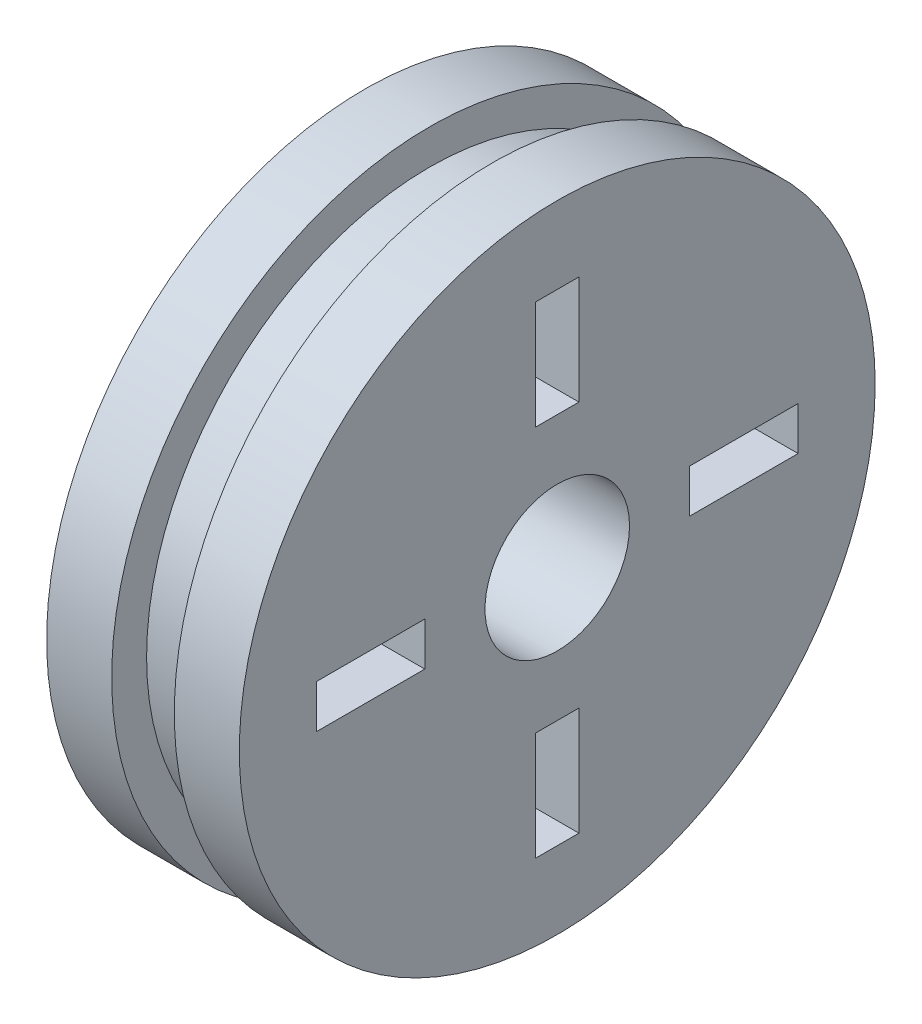
ISO-10303-21;
HEADER;
FILE_DESCRIPTION(('STEP AP214'),'2;1');
FILE_NAME('part.step','',(''),(''),'','','');
FILE_SCHEMA(('AUTOMOTIVE_DESIGN { 1 0 10303 214 1 1 1 1 }'));
ENDSEC;
DATA;
#1=APPLICATION_CONTEXT('core data for automotive mechanical design processes');
#2=APPLICATION_PROTOCOL_DEFINITION('international standard','automotive_design',2000,#1);
#3=PRODUCT_CONTEXT('',#1,'mechanical');
#4=PRODUCT('Part','Part','',(#3));
#5=PRODUCT_RELATED_PRODUCT_CATEGORY('part','',(#4));
#6=PRODUCT_DEFINITION_FORMATION('','',#4);
#7=PRODUCT_DEFINITION_CONTEXT('part definition',#1,'design');
#8=PRODUCT_DEFINITION('design','',#6,#7);
#9=PRODUCT_DEFINITION_SHAPE('','',#8);
#10=(LENGTH_UNIT() NAMED_UNIT(*) SI_UNIT(.MILLI.,.METRE.));
#11=(NAMED_UNIT(*) PLANE_ANGLE_UNIT() SI_UNIT($,.RADIAN.));
#12=(NAMED_UNIT(*) SI_UNIT($,.STERADIAN.) SOLID_ANGLE_UNIT());
#13=UNCERTAINTY_MEASURE_WITH_UNIT(LENGTH_MEASURE(1.E-05),#10,'distance_accuracy_value','');
#14=(GEOMETRIC_REPRESENTATION_CONTEXT(3) GLOBAL_UNCERTAINTY_ASSIGNED_CONTEXT((#13)) GLOBAL_UNIT_ASSIGNED_CONTEXT((#10,
#11,#12)) REPRESENTATION_CONTEXT('',''));
#15=CARTESIAN_POINT('',(0.,0.,0.));
#16=DIRECTION('',(0.,0.,1.));
#17=DIRECTION('',(1.,0.,0.));
#18=AXIS2_PLACEMENT_3D('',#15,#16,#17);
#19=CARTESIAN_POINT('',(85.2,-65.,-52.));
#20=DIRECTION('',(1.,0.,0.));
#21=DIRECTION('',(0.,0.,-1.));
#22=AXIS2_PLACEMENT_3D('',#19,#20,#21);
#23=PLANE('',#22);
#24=CARTESIAN_POINT('',(85.2,-65.,-52.));
#25=DIRECTION('',(1.,0.,0.));
#26=DIRECTION('',(0.,0.,-1.));
#27=AXIS2_PLACEMENT_3D('',#24,#25,#26);
#28=CIRCLE('',#27,3.);
#29=CARTESIAN_POINT('',(85.2,-65.,-55.));
#30=VERTEX_POINT('',#29);
#31=EDGE_CURVE('E936',#30,#30,#28,.F.);
#32=ORIENTED_EDGE('',*,*,#31,.T.);
#33=EDGE_LOOP('',(#32));
#34=FACE_BOUND('',#33,.T.);
#35=CARTESIAN_POINT('',(85.2,-65.,-52.));
#36=DIRECTION('',(1.,0.,0.));
#37=DIRECTION('',(0.,0.,-1.));
#38=AXIS2_PLACEMENT_3D('',#35,#36,#37);
#39=CIRCLE('',#38,13.2);
#40=CARTESIAN_POINT('',(85.2,-65.,-65.2));
#41=VERTEX_POINT('',#40);
#42=EDGE_CURVE('E386',#41,#41,#39,.T.);
#43=ORIENTED_EDGE('',*,*,#42,.T.);
#44=EDGE_LOOP('',(#43));
#45=FACE_BOUND('',#44,.T.);
#46=DIRECTION('',(0.,0.,1.));
#47=VECTOR('',#46,1.);
#48=CARTESIAN_POINT('',(85.2,-59.5,-52.));
#49=LINE('',#48,#47);
#50=CARTESIAN_POINT('',(85.2,-59.5,-52.9));
#51=VERTEX_POINT('',#50);
#52=CARTESIAN_POINT('',(85.2,-59.5,-51.1));
#53=VERTEX_POINT('',#52);
#54=EDGE_CURVE('E363',#51,#53,#49,.T.);
#55=ORIENTED_EDGE('',*,*,#54,.T.);
#56=DIRECTION('',(0.,1.,0.));
#57=VECTOR('',#56,1.);
#58=CARTESIAN_POINT('',(85.2,-65.,-51.1));
#59=LINE('',#58,#57);
#60=CARTESIAN_POINT('',(85.2,-55.,-51.1));
#61=VERTEX_POINT('',#60);
#62=EDGE_CURVE('E357',#53,#61,#59,.T.);
#63=ORIENTED_EDGE('',*,*,#62,.T.);
#64=DIRECTION('',(0.,0.,-1.));
#65=VECTOR('',#64,1.);
#66=CARTESIAN_POINT('',(85.2,-55.,-52.));
#67=LINE('',#66,#65);
#68=CARTESIAN_POINT('',(85.2,-55.,-52.9));
#69=VERTEX_POINT('',#68);
#70=EDGE_CURVE('E360',#61,#69,#67,.T.);
#71=ORIENTED_EDGE('',*,*,#70,.T.);
#72=DIRECTION('',(0.,1.,0.));
#73=VECTOR('',#72,1.);
#74=CARTESIAN_POINT('',(85.2,-65.,-52.9));
#75=LINE('',#74,#73);
#76=EDGE_CURVE('E353',#51,#69,#75,.T.);
#77=ORIENTED_EDGE('',*,*,#76,.F.);
#78=EDGE_LOOP('',(#55,#63,#71,#77));
#79=FACE_BOUND('',#78,.T.);
#80=DIRECTION('',(0.,0.,1.));
#81=VECTOR('',#80,1.);
#82=CARTESIAN_POINT('',(85.2,-75.,-52.));
#83=LINE('',#82,#81);
#84=CARTESIAN_POINT('',(85.2,-75.,-52.9));
#85=VERTEX_POINT('',#84);
#86=CARTESIAN_POINT('',(85.2,-75.,-51.1));
#87=VERTEX_POINT('',#86);
#88=EDGE_CURVE('E323',#85,#87,#83,.T.);
#89=ORIENTED_EDGE('',*,*,#88,.T.);
#90=DIRECTION('',(0.,1.,0.));
#91=VECTOR('',#90,1.);
#92=CARTESIAN_POINT('',(85.2,-65.,-51.1));
#93=LINE('',#92,#91);
#94=CARTESIAN_POINT('',(85.2,-70.5,-51.1));
#95=VERTEX_POINT('',#94);
#96=EDGE_CURVE('E317',#87,#95,#93,.T.);
#97=ORIENTED_EDGE('',*,*,#96,.T.);
#98=DIRECTION('',(0.,0.,-1.));
#99=VECTOR('',#98,1.);
#100=CARTESIAN_POINT('',(85.2,-70.5,-52.));
#101=LINE('',#100,#99);
#102=CARTESIAN_POINT('',(85.2,-70.5,-52.9));
#103=VERTEX_POINT('',#102);
#104=EDGE_CURVE('E320',#95,#103,#101,.T.);
#105=ORIENTED_EDGE('',*,*,#104,.T.);
#106=DIRECTION('',(0.,1.,0.));
#107=VECTOR('',#106,1.);
#108=CARTESIAN_POINT('',(85.2,-65.,-52.9));
#109=LINE('',#108,#107);
#110=EDGE_CURVE('E313',#85,#103,#109,.T.);
#111=ORIENTED_EDGE('',*,*,#110,.F.);
#112=EDGE_LOOP('',(#89,#97,#105,#111));
#113=FACE_BOUND('',#112,.T.);
#114=DIRECTION('',(0.,0.,1.));
#115=VECTOR('',#114,1.);
#116=CARTESIAN_POINT('',(85.2,-65.9,-52.));
#117=LINE('',#116,#115);
#118=CARTESIAN_POINT('',(85.2,-65.9,-46.5));
#119=VERTEX_POINT('',#118);
#120=CARTESIAN_POINT('',(85.2,-65.9,-42.));
#121=VERTEX_POINT('',#120);
#122=EDGE_CURVE('E286',#119,#121,#117,.T.);
#123=ORIENTED_EDGE('',*,*,#122,.T.);
#124=DIRECTION('',(0.,1.,0.));
#125=VECTOR('',#124,1.);
#126=CARTESIAN_POINT('',(85.2,-65.,-42.));
#127=LINE('',#126,#125);
#128=CARTESIAN_POINT('',(85.2,-64.1,-42.));
#129=VERTEX_POINT('',#128);
#130=EDGE_CURVE('E280',#121,#129,#127,.T.);
#131=ORIENTED_EDGE('',*,*,#130,.T.);
#132=DIRECTION('',(0.,0.,-1.));
#133=VECTOR('',#132,1.);
#134=CARTESIAN_POINT('',(85.2,-64.1,-52.));
#135=LINE('',#134,#133);
#136=CARTESIAN_POINT('',(85.2,-64.1,-46.5));
#137=VERTEX_POINT('',#136);
#138=EDGE_CURVE('E283',#129,#137,#135,.T.);
#139=ORIENTED_EDGE('',*,*,#138,.T.);
#140=DIRECTION('',(0.,1.,0.));
#141=VECTOR('',#140,1.);
#142=CARTESIAN_POINT('',(85.2,-65.,-46.5));
#143=LINE('',#142,#141);
#144=EDGE_CURVE('E276',#119,#137,#143,.T.);
#145=ORIENTED_EDGE('',*,*,#144,.F.);
#146=EDGE_LOOP('',(#123,#131,#139,#145));
#147=FACE_BOUND('',#146,.T.);
#148=DIRECTION('',(0.,0.,1.));
#149=VECTOR('',#148,1.);
#150=CARTESIAN_POINT('',(85.2,-65.9,-52.));
#151=LINE('',#150,#149);
#152=CARTESIAN_POINT('',(85.2,-65.9,-62.));
#153=VERTEX_POINT('',#152);
#154=CARTESIAN_POINT('',(85.2,-65.9,-57.5));
#155=VERTEX_POINT('',#154);
#156=EDGE_CURVE('E246',#153,#155,#151,.T.);
#157=ORIENTED_EDGE('',*,*,#156,.T.);
#158=DIRECTION('',(0.,1.,0.));
#159=VECTOR('',#158,1.);
#160=CARTESIAN_POINT('',(85.2,-65.,-57.5));
#161=LINE('',#160,#159);
#162=CARTESIAN_POINT('',(85.2,-64.1,-57.5));
#163=VERTEX_POINT('',#162);
#164=EDGE_CURVE('E232',#155,#163,#161,.T.);
#165=ORIENTED_EDGE('',*,*,#164,.T.);
#166=DIRECTION('',(0.,0.,-1.));
#167=VECTOR('',#166,1.);
#168=CARTESIAN_POINT('',(85.2,-64.1,-52.));
#169=LINE('',#168,#167);
#170=CARTESIAN_POINT('',(85.2,-64.1,-62.));
#171=VERTEX_POINT('',#170);
#172=EDGE_CURVE('E238',#163,#171,#169,.T.);
#173=ORIENTED_EDGE('',*,*,#172,.T.);
#174=DIRECTION('',(0.,1.,0.));
#175=VECTOR('',#174,1.);
#176=CARTESIAN_POINT('',(85.2,-65.,-62.));
#177=LINE('',#176,#175);
#178=EDGE_CURVE('E227',#153,#171,#177,.T.);
#179=ORIENTED_EDGE('',*,*,#178,.F.);
#180=EDGE_LOOP('',(#157,#165,#173,#179));
#181=FACE_BOUND('',#180,.T.);
#182=ADVANCED_FACE('F45',(#34,#45,#79,#113,#147,#181),#23,.T.);
#183=CARTESIAN_POINT('',(79.,-65.,-52.));
#184=DIRECTION('',(1.,0.,0.));
#185=DIRECTION('',(0.,0.,-1.));
#186=AXIS2_PLACEMENT_3D('',#183,#184,#185);
#187=PLANE('',#186);
#188=CARTESIAN_POINT('',(79.,-65.,-52.));
#189=DIRECTION('',(1.,0.,0.));
#190=DIRECTION('',(0.,0.,-1.));
#191=AXIS2_PLACEMENT_3D('',#188,#189,#190);
#192=CIRCLE('',#191,3.);
#193=CARTESIAN_POINT('',(79.,-65.,-55.));
#194=VERTEX_POINT('',#193);
#195=EDGE_CURVE('E49',#194,#194,#192,.F.);
#196=ORIENTED_EDGE('',*,*,#195,.F.);
#197=EDGE_LOOP('',(#196));
#198=FACE_BOUND('',#197,.T.);
#199=DIRECTION('',(0.,1.,0.));
#200=VECTOR('',#199,1.);
#201=CARTESIAN_POINT('',(79.,-65.,-51.1));
#202=LINE('',#201,#200);
#203=CARTESIAN_POINT('',(79.,-59.5,-51.1));
#204=VERTEX_POINT('',#203);
#205=CARTESIAN_POINT('',(79.,-55.,-51.1));
#206=VERTEX_POINT('',#205);
#207=EDGE_CURVE('E412',#204,#206,#202,.T.);
#208=ORIENTED_EDGE('',*,*,#207,.F.);
#209=DIRECTION('',(0.,0.,1.));
#210=VECTOR('',#209,1.);
#211=CARTESIAN_POINT('',(79.,-59.5,-52.));
#212=LINE('',#211,#210);
#213=CARTESIAN_POINT('',(79.,-59.5,-52.9));
#214=VERTEX_POINT('',#213);
#215=EDGE_CURVE('E410',#214,#204,#212,.T.);
#216=ORIENTED_EDGE('',*,*,#215,.F.);
#217=DIRECTION('',(0.,1.,0.));
#218=VECTOR('',#217,1.);
#219=CARTESIAN_POINT('',(79.,-65.,-52.9));
#220=LINE('',#219,#218);
#221=CARTESIAN_POINT('',(79.,-55.,-52.9));
#222=VERTEX_POINT('',#221);
#223=EDGE_CURVE('E404',#214,#222,#220,.T.);
#224=ORIENTED_EDGE('',*,*,#223,.T.);
#225=DIRECTION('',(0.,0.,-1.));
#226=VECTOR('',#225,1.);
#227=CARTESIAN_POINT('',(79.,-55.,-52.));
#228=LINE('',#227,#226);
#229=EDGE_CURVE('E407',#206,#222,#228,.T.);
#230=ORIENTED_EDGE('',*,*,#229,.F.);
#231=EDGE_LOOP('',(#208,#216,#224,#230));
#232=FACE_BOUND('',#231,.T.);
#233=DIRECTION('',(0.,1.,0.));
#234=VECTOR('',#233,1.);
#235=CARTESIAN_POINT('',(79.,-65.,-51.1));
#236=LINE('',#235,#234);
#237=CARTESIAN_POINT('',(79.,-75.,-51.1));
#238=VERTEX_POINT('',#237);
#239=CARTESIAN_POINT('',(79.,-70.5,-51.1));
#240=VERTEX_POINT('',#239);
#241=EDGE_CURVE('E424',#238,#240,#236,.T.);
#242=ORIENTED_EDGE('',*,*,#241,.F.);
#243=DIRECTION('',(0.,0.,1.));
#244=VECTOR('',#243,1.);
#245=CARTESIAN_POINT('',(79.,-75.,-52.));
#246=LINE('',#245,#244);
#247=CARTESIAN_POINT('',(79.,-75.,-52.9));
#248=VERTEX_POINT('',#247);
#249=EDGE_CURVE('E422',#248,#238,#246,.T.);
#250=ORIENTED_EDGE('',*,*,#249,.F.);
#251=DIRECTION('',(0.,1.,0.));
#252=VECTOR('',#251,1.);
#253=CARTESIAN_POINT('',(79.,-65.,-52.9));
#254=LINE('',#253,#252);
#255=CARTESIAN_POINT('',(79.,-70.5,-52.9));
#256=VERTEX_POINT('',#255);
#257=EDGE_CURVE('E416',#248,#256,#254,.T.);
#258=ORIENTED_EDGE('',*,*,#257,.T.);
#259=DIRECTION('',(0.,0.,-1.));
#260=VECTOR('',#259,1.);
#261=CARTESIAN_POINT('',(79.,-70.5,-52.));
#262=LINE('',#261,#260);
#263=EDGE_CURVE('E419',#240,#256,#262,.T.);
#264=ORIENTED_EDGE('',*,*,#263,.F.);
#265=EDGE_LOOP('',(#242,#250,#258,#264));
#266=FACE_BOUND('',#265,.T.);
#267=DIRECTION('',(0.,1.,0.));
#268=VECTOR('',#267,1.);
#269=CARTESIAN_POINT('',(79.,-65.,-42.));
#270=LINE('',#269,#268);
#271=CARTESIAN_POINT('',(79.,-65.9,-42.));
#272=VERTEX_POINT('',#271);
#273=CARTESIAN_POINT('',(79.,-64.1,-42.));
#274=VERTEX_POINT('',#273);
#275=EDGE_CURVE('E442',#272,#274,#270,.T.);
#276=ORIENTED_EDGE('',*,*,#275,.F.);
#277=DIRECTION('',(0.,0.,1.));
#278=VECTOR('',#277,1.);
#279=CARTESIAN_POINT('',(79.,-65.9,-52.));
#280=LINE('',#279,#278);
#281=CARTESIAN_POINT('',(79.,-65.9,-46.5));
#282=VERTEX_POINT('',#281);
#283=EDGE_CURVE('E440',#282,#272,#280,.T.);
#284=ORIENTED_EDGE('',*,*,#283,.F.);
#285=DIRECTION('',(0.,1.,0.));
#286=VECTOR('',#285,1.);
#287=CARTESIAN_POINT('',(79.,-65.,-46.5));
#288=LINE('',#287,#286);
#289=CARTESIAN_POINT('',(79.,-64.1,-46.5));
#290=VERTEX_POINT('',#289);
#291=EDGE_CURVE('E434',#282,#290,#288,.T.);
#292=ORIENTED_EDGE('',*,*,#291,.T.);
#293=DIRECTION('',(0.,0.,-1.));
#294=VECTOR('',#293,1.);
#295=CARTESIAN_POINT('',(79.,-64.1,-52.));
#296=LINE('',#295,#294);
#297=EDGE_CURVE('E437',#274,#290,#296,.T.);
#298=ORIENTED_EDGE('',*,*,#297,.F.);
#299=EDGE_LOOP('',(#276,#284,#292,#298));
#300=FACE_BOUND('',#299,.T.);
#301=DIRECTION('',(0.,1.,0.));
#302=VECTOR('',#301,1.);
#303=CARTESIAN_POINT('',(79.,-65.,-55.3));
#304=LINE('',#303,#302);
#305=CARTESIAN_POINT('',(79.,-61.7,-55.3));
#306=VERTEX_POINT('',#305);
#307=CARTESIAN_POINT('',(79.,-53.5,-55.3));
#308=VERTEX_POINT('',#307);
#309=EDGE_CURVE('E366',#306,#308,#304,.T.);
#310=ORIENTED_EDGE('',*,*,#309,.F.);
#311=DIRECTION('',(0.,0.,-1.));
#312=VECTOR('',#311,1.);
#313=CARTESIAN_POINT('',(79.,-61.7,-52.));
#314=LINE('',#313,#312);
#315=CARTESIAN_POINT('',(79.,-61.7,-63.5));
#316=VERTEX_POINT('',#315);
#317=EDGE_CURVE('E259',#306,#316,#314,.T.);
#318=ORIENTED_EDGE('',*,*,#317,.T.);
#319=DIRECTION('',(0.,1.,0.));
#320=VECTOR('',#319,1.);
#321=CARTESIAN_POINT('',(79.,-68.3,-63.5));
#322=LINE('',#321,#320);
#323=CARTESIAN_POINT('',(79.,-68.3,-63.5));
#324=VERTEX_POINT('',#323);
#325=EDGE_CURVE('E253',#324,#316,#322,.T.);
#326=ORIENTED_EDGE('',*,*,#325,.F.);
#327=DIRECTION('',(0.,0.,-1.));
#328=VECTOR('',#327,1.);
#329=CARTESIAN_POINT('',(79.,-68.3,-52.));
#330=LINE('',#329,#328);
#331=CARTESIAN_POINT('',(79.,-68.3,-55.3));
#332=VERTEX_POINT('',#331);
#333=EDGE_CURVE('E261',#332,#324,#330,.T.);
#334=ORIENTED_EDGE('',*,*,#333,.F.);
#335=DIRECTION('',(0.,1.,0.));
#336=VECTOR('',#335,1.);
#337=CARTESIAN_POINT('',(79.,-76.5,-55.3));
#338=LINE('',#337,#336);
#339=CARTESIAN_POINT('',(79.,-76.5,-55.3));
#340=VERTEX_POINT('',#339);
#341=EDGE_CURVE('E330',#340,#332,#338,.T.);
#342=ORIENTED_EDGE('',*,*,#341,.F.);
#343=DIRECTION('',(0.,0.,-1.));
#344=VECTOR('',#343,1.);
#345=CARTESIAN_POINT('',(79.,-76.5,-48.7));
#346=LINE('',#345,#344);
#347=CARTESIAN_POINT('',(79.,-76.5,-48.7));
#348=VERTEX_POINT('',#347);
#349=EDGE_CURVE('E333',#348,#340,#346,.T.);
#350=ORIENTED_EDGE('',*,*,#349,.F.);
#351=DIRECTION('',(0.,1.,0.));
#352=VECTOR('',#351,1.);
#353=CARTESIAN_POINT('',(79.,-76.5,-48.7));
#354=LINE('',#353,#352);
#355=CARTESIAN_POINT('',(79.,-68.3,-48.7));
#356=VERTEX_POINT('',#355);
#357=EDGE_CURVE('E329',#348,#356,#354,.T.);
#358=ORIENTED_EDGE('',*,*,#357,.T.);
#359=DIRECTION('',(0.,0.,-1.));
#360=VECTOR('',#359,1.);
#361=CARTESIAN_POINT('',(79.,-68.3,-40.5));
#362=LINE('',#361,#360);
#363=CARTESIAN_POINT('',(79.,-68.3,-40.5));
#364=VERTEX_POINT('',#363);
#365=EDGE_CURVE('E299',#364,#356,#362,.T.);
#366=ORIENTED_EDGE('',*,*,#365,.F.);
#367=DIRECTION('',(0.,1.,0.));
#368=VECTOR('',#367,1.);
#369=CARTESIAN_POINT('',(79.,-68.3,-40.5));
#370=LINE('',#369,#368);
#371=CARTESIAN_POINT('',(79.,-61.7,-40.5));
#372=VERTEX_POINT('',#371);
#373=EDGE_CURVE('E291',#364,#372,#370,.T.);
#374=ORIENTED_EDGE('',*,*,#373,.T.);
#375=DIRECTION('',(0.,0.,-1.));
#376=VECTOR('',#375,1.);
#377=CARTESIAN_POINT('',(79.,-61.7,-40.5));
#378=LINE('',#377,#376);
#379=CARTESIAN_POINT('',(79.,-61.7,-48.7));
#380=VERTEX_POINT('',#379);
#381=EDGE_CURVE('E296',#372,#380,#378,.T.);
#382=ORIENTED_EDGE('',*,*,#381,.T.);
#383=DIRECTION('',(0.,1.,0.));
#384=VECTOR('',#383,1.);
#385=CARTESIAN_POINT('',(79.,-65.,-48.7));
#386=LINE('',#385,#384);
#387=CARTESIAN_POINT('',(79.,-53.5,-48.7));
#388=VERTEX_POINT('',#387);
#389=EDGE_CURVE('E367',#380,#388,#386,.T.);
#390=ORIENTED_EDGE('',*,*,#389,.T.);
#391=DIRECTION('',(0.,0.,-1.));
#392=VECTOR('',#391,1.);
#393=CARTESIAN_POINT('',(79.,-53.5,-48.7));
#394=LINE('',#393,#392);
#395=EDGE_CURVE('E373',#388,#308,#394,.T.);
#396=ORIENTED_EDGE('',*,*,#395,.T.);
#397=EDGE_LOOP('',(#310,#318,#326,#334,#342,#350,#358,#366,#374,#382,#390,#396));
#398=FACE_BOUND('',#397,.T.);
#399=DIRECTION('',(0.,1.,0.));
#400=VECTOR('',#399,1.);
#401=CARTESIAN_POINT('',(79.,-65.,-57.5));
#402=LINE('',#401,#400);
#403=CARTESIAN_POINT('',(79.,-65.9,-57.5));
#404=VERTEX_POINT('',#403);
#405=CARTESIAN_POINT('',(79.,-64.1,-57.5));
#406=VERTEX_POINT('',#405);
#407=EDGE_CURVE('E11',#404,#406,#402,.T.);
#408=ORIENTED_EDGE('',*,*,#407,.F.);
#409=DIRECTION('',(0.,0.,1.));
#410=VECTOR('',#409,1.);
#411=CARTESIAN_POINT('',(79.,-65.9,-52.));
#412=LINE('',#411,#410);
#413=CARTESIAN_POINT('',(79.,-65.9,-62.));
#414=VERTEX_POINT('',#413);
#415=EDGE_CURVE('E54',#414,#404,#412,.T.);
#416=ORIENTED_EDGE('',*,*,#415,.F.);
#417=DIRECTION('',(0.,1.,0.));
#418=VECTOR('',#417,1.);
#419=CARTESIAN_POINT('',(79.,-65.,-62.));
#420=LINE('',#419,#418);
#421=CARTESIAN_POINT('',(79.,-64.1,-62.));
#422=VERTEX_POINT('',#421);
#423=EDGE_CURVE('E452',#414,#422,#420,.T.);
#424=ORIENTED_EDGE('',*,*,#423,.T.);
#425=DIRECTION('',(0.,0.,-1.));
#426=VECTOR('',#425,1.);
#427=CARTESIAN_POINT('',(79.,-64.1,-52.));
#428=LINE('',#427,#426);
#429=EDGE_CURVE('E241',#406,#422,#428,.T.);
#430=ORIENTED_EDGE('',*,*,#429,.F.);
#431=EDGE_LOOP('',(#408,#416,#424,#430));
#432=FACE_BOUND('',#431,.T.);
#433=ADVANCED_FACE('F465',(#198,#232,#266,#300,#398,#432),#187,.F.);
#434=CARTESIAN_POINT('',(77.2,-65.,-52.));
#435=DIRECTION('',(1.,0.,0.));
#436=DIRECTION('',(0.,0.,-1.));
#437=AXIS2_PLACEMENT_3D('',#434,#435,#436);
#438=PLANE('',#437);
#439=CARTESIAN_POINT('',(77.2,-65.,-52.));
#440=DIRECTION('',(1.,0.,0.));
#441=DIRECTION('',(0.,0.,-1.));
#442=AXIS2_PLACEMENT_3D('',#439,#440,#441);
#443=CIRCLE('',#442,13.2);
#444=CARTESIAN_POINT('',(77.2,-65.,-65.2));
#445=VERTEX_POINT('',#444);
#446=EDGE_CURVE('E397',#445,#445,#443,.T.);
#447=ORIENTED_EDGE('',*,*,#446,.F.);
#448=EDGE_LOOP('',(#447));
#449=FACE_BOUND('',#448,.T.);
#450=DIRECTION('',(0.,0.,1.));
#451=VECTOR('',#450,1.);
#452=CARTESIAN_POINT('',(77.2,-68.3,-52.));
#453=LINE('',#452,#451);
#454=CARTESIAN_POINT('',(77.2,-68.3,-63.5));
#455=VERTEX_POINT('',#454);
#456=CARTESIAN_POINT('',(77.2,-68.3,-55.3));
#457=VERTEX_POINT('',#456);
#458=EDGE_CURVE('E264',#455,#457,#453,.T.);
#459=ORIENTED_EDGE('',*,*,#458,.F.);
#460=DIRECTION('',(0.,1.,0.));
#461=VECTOR('',#460,1.);
#462=CARTESIAN_POINT('',(77.2,-65.,-63.5));
#463=LINE('',#462,#461);
#464=CARTESIAN_POINT('',(77.2,-61.7,-63.5));
#465=VERTEX_POINT('',#464);
#466=EDGE_CURVE('E449',#455,#465,#463,.T.);
#467=ORIENTED_EDGE('',*,*,#466,.T.);
#468=DIRECTION('',(0.,0.,-1.));
#469=VECTOR('',#468,1.);
#470=CARTESIAN_POINT('',(77.2,-61.7,-52.));
#471=LINE('',#470,#469);
#472=CARTESIAN_POINT('',(77.2,-61.7,-55.3));
#473=VERTEX_POINT('',#472);
#474=EDGE_CURVE('E266',#473,#465,#471,.T.);
#475=ORIENTED_EDGE('',*,*,#474,.F.);
#476=DIRECTION('',(0.,1.,0.));
#477=VECTOR('',#476,1.);
#478=CARTESIAN_POINT('',(77.2,-65.,-55.3));
#479=LINE('',#478,#477);
#480=CARTESIAN_POINT('',(77.2,-53.5,-55.3));
#481=VERTEX_POINT('',#480);
#482=EDGE_CURVE('E379',#473,#481,#479,.T.);
#483=ORIENTED_EDGE('',*,*,#482,.T.);
#484=DIRECTION('',(0.,0.,-1.));
#485=VECTOR('',#484,1.);
#486=CARTESIAN_POINT('',(77.2,-53.5,-52.));
#487=LINE('',#486,#485);
#488=CARTESIAN_POINT('',(77.2,-53.5,-48.7));
#489=VERTEX_POINT('',#488);
#490=EDGE_CURVE('E396',#489,#481,#487,.T.);
#491=ORIENTED_EDGE('',*,*,#490,.F.);
#492=DIRECTION('',(0.,1.,0.));
#493=VECTOR('',#492,1.);
#494=CARTESIAN_POINT('',(77.2,-65.,-48.7));
#495=LINE('',#494,#493);
#496=CARTESIAN_POINT('',(77.2,-61.7,-48.7));
#497=VERTEX_POINT('',#496);
#498=EDGE_CURVE('E381',#497,#489,#495,.T.);
#499=ORIENTED_EDGE('',*,*,#498,.F.);
#500=DIRECTION('',(0.,0.,-1.));
#501=VECTOR('',#500,1.);
#502=CARTESIAN_POINT('',(77.2,-61.7,-52.));
#503=LINE('',#502,#501);
#504=CARTESIAN_POINT('',(77.2,-61.7,-40.5));
#505=VERTEX_POINT('',#504);
#506=EDGE_CURVE('E303',#505,#497,#503,.T.);
#507=ORIENTED_EDGE('',*,*,#506,.F.);
#508=DIRECTION('',(0.,1.,0.));
#509=VECTOR('',#508,1.);
#510=CARTESIAN_POINT('',(77.2,-65.,-40.5));
#511=LINE('',#510,#509);
#512=CARTESIAN_POINT('',(77.2,-68.3,-40.5));
#513=VERTEX_POINT('',#512);
#514=EDGE_CURVE('E432',#513,#505,#511,.T.);
#515=ORIENTED_EDGE('',*,*,#514,.F.);
#516=DIRECTION('',(0.,0.,1.));
#517=VECTOR('',#516,1.);
#518=CARTESIAN_POINT('',(77.2,-68.3,-52.));
#519=LINE('',#518,#517);
#520=CARTESIAN_POINT('',(77.2,-68.3,-48.7));
#521=VERTEX_POINT('',#520);
#522=EDGE_CURVE('E301',#521,#513,#519,.T.);
#523=ORIENTED_EDGE('',*,*,#522,.F.);
#524=DIRECTION('',(0.,1.,0.));
#525=VECTOR('',#524,1.);
#526=CARTESIAN_POINT('',(77.2,-65.,-48.7));
#527=LINE('',#526,#525);
#528=CARTESIAN_POINT('',(77.2,-76.5,-48.7));
#529=VERTEX_POINT('',#528);
#530=EDGE_CURVE('E342',#529,#521,#527,.T.);
#531=ORIENTED_EDGE('',*,*,#530,.F.);
#532=DIRECTION('',(0.,0.,1.));
#533=VECTOR('',#532,1.);
#534=CARTESIAN_POINT('',(77.2,-76.5,-52.));
#535=LINE('',#534,#533);
#536=CARTESIAN_POINT('',(77.2,-76.5,-55.3));
#537=VERTEX_POINT('',#536);
#538=EDGE_CURVE('E414',#537,#529,#535,.T.);
#539=ORIENTED_EDGE('',*,*,#538,.F.);
#540=DIRECTION('',(0.,1.,0.));
#541=VECTOR('',#540,1.);
#542=CARTESIAN_POINT('',(77.2,-65.,-55.3));
#543=LINE('',#542,#541);
#544=EDGE_CURVE('E339',#537,#457,#543,.T.);
#545=ORIENTED_EDGE('',*,*,#544,.T.);
#546=EDGE_LOOP('',(#459,#467,#475,#483,#491,#499,#507,#515,#523,#531,#539,#545));
#547=FACE_BOUND('',#546,.T.);
#548=ADVANCED_FACE('F467',(#449,#547),#438,.F.);
#549=CARTESIAN_POINT('',(0.,0.,-55.3));
#550=DIRECTION('',(0.,0.,-1.));
#551=DIRECTION('',(-1.,0.,0.));
#552=AXIS2_PLACEMENT_3D('',#549,#550,#551);
#553=PLANE('',#552);
#554=DIRECTION('',(-1.,0.,0.));
#555=VECTOR('',#554,1.);
#556=CARTESIAN_POINT('',(0.,-61.7,-55.3));
#557=LINE('',#556,#555);
#558=EDGE_CURVE('E447',#306,#473,#557,.T.);
#559=ORIENTED_EDGE('',*,*,#558,.F.);
#560=ORIENTED_EDGE('',*,*,#309,.T.);
#561=DIRECTION('',(-1.,0.,0.));
#562=VECTOR('',#561,1.);
#563=CARTESIAN_POINT('',(76.7,-53.5,-55.3));
#564=LINE('',#563,#562);
#565=EDGE_CURVE('E370',#308,#481,#564,.T.);
#566=ORIENTED_EDGE('',*,*,#565,.T.);
#567=ORIENTED_EDGE('',*,*,#482,.F.);
#568=EDGE_LOOP('',(#559,#560,#566,#567));
#569=FACE_BOUND('',#568,.T.);
#570=ADVANCED_FACE('F474',(#569),#553,.F.);
#571=CARTESIAN_POINT('',(0.,0.,-55.3));
#572=DIRECTION('',(0.,0.,-1.));
#573=DIRECTION('',(-1.,0.,0.));
#574=AXIS2_PLACEMENT_3D('',#571,#572,#573);
#575=PLANE('',#574);
#576=DIRECTION('',(1.,0.,0.));
#577=VECTOR('',#576,1.);
#578=CARTESIAN_POINT('',(0.,-68.3,-55.3));
#579=LINE('',#578,#577);
#580=EDGE_CURVE('E444',#457,#332,#579,.T.);
#581=ORIENTED_EDGE('',*,*,#580,.F.);
#582=ORIENTED_EDGE('',*,*,#544,.F.);
#583=DIRECTION('',(1.,0.,0.));
#584=VECTOR('',#583,1.);
#585=CARTESIAN_POINT('',(76.7,-76.5,-55.3));
#586=LINE('',#585,#584);
#587=EDGE_CURVE('E326',#537,#340,#586,.T.);
#588=ORIENTED_EDGE('',*,*,#587,.T.);
#589=ORIENTED_EDGE('',*,*,#341,.T.);
#590=EDGE_LOOP('',(#581,#582,#588,#589));
#591=FACE_BOUND('',#590,.T.);
#592=ADVANCED_FACE('F525',(#591),#575,.F.);
#593=CARTESIAN_POINT('',(0.,0.,-48.7));
#594=DIRECTION('',(0.,0.,-1.));
#595=DIRECTION('',(-1.,0.,0.));
#596=AXIS2_PLACEMENT_3D('',#593,#594,#595);
#597=PLANE('',#596);
#598=ORIENTED_EDGE('',*,*,#389,.F.);
#599=DIRECTION('',(-1.,0.,0.));
#600=VECTOR('',#599,1.);
#601=CARTESIAN_POINT('',(0.,-61.7,-48.7));
#602=LINE('',#601,#600);
#603=EDGE_CURVE('E429',#380,#497,#602,.T.);
#604=ORIENTED_EDGE('',*,*,#603,.T.);
#605=ORIENTED_EDGE('',*,*,#498,.T.);
#606=DIRECTION('',(-1.,0.,0.));
#607=VECTOR('',#606,1.);
#608=CARTESIAN_POINT('',(76.7,-53.5,-48.7));
#609=LINE('',#608,#607);
#610=EDGE_CURVE('E369',#388,#489,#609,.T.);
#611=ORIENTED_EDGE('',*,*,#610,.F.);
#612=EDGE_LOOP('',(#598,#604,#605,#611));
#613=FACE_BOUND('',#612,.T.);
#614=ADVANCED_FACE('F512',(#613),#597,.T.);
#615=CARTESIAN_POINT('',(0.,0.,-48.7));
#616=DIRECTION('',(0.,0.,-1.));
#617=DIRECTION('',(-1.,0.,0.));
#618=AXIS2_PLACEMENT_3D('',#615,#616,#617);
#619=PLANE('',#618);
#620=ORIENTED_EDGE('',*,*,#530,.T.);
#621=DIRECTION('',(1.,0.,0.));
#622=VECTOR('',#621,1.);
#623=CARTESIAN_POINT('',(0.,-68.3,-48.7));
#624=LINE('',#623,#622);
#625=EDGE_CURVE('E426',#521,#356,#624,.T.);
#626=ORIENTED_EDGE('',*,*,#625,.T.);
#627=ORIENTED_EDGE('',*,*,#357,.F.);
#628=DIRECTION('',(1.,0.,0.));
#629=VECTOR('',#628,1.);
#630=CARTESIAN_POINT('',(76.7,-76.5,-48.7));
#631=LINE('',#630,#629);
#632=EDGE_CURVE('E327',#529,#348,#631,.T.);
#633=ORIENTED_EDGE('',*,*,#632,.F.);
#634=EDGE_LOOP('',(#620,#626,#627,#633));
#635=FACE_BOUND('',#634,.T.);
#636=ADVANCED_FACE('F502',(#635),#619,.T.);
#637=CARTESIAN_POINT('',(85.2,-65.,-52.));
#638=DIRECTION('',(-1.,0.,0.));
#639=DIRECTION('',(0.,0.,1.));
#640=AXIS2_PLACEMENT_3D('',#637,#638,#639);
#641=CYLINDRICAL_SURFACE('',#640,13.2);
#642=ORIENTED_EDGE('',*,*,#446,.T.);
#643=EDGE_LOOP('',(#642));
#644=FACE_BOUND('',#643,.T.);
#645=CARTESIAN_POINT('',(79.9,-65.,-52.));
#646=DIRECTION('',(1.,0.,0.));
#647=DIRECTION('',(0.,0.,-1.));
#648=AXIS2_PLACEMENT_3D('',#645,#646,#647);
#649=CIRCLE('',#648,13.2);
#650=CARTESIAN_POINT('',(79.9,-65.,-65.2));
#651=VERTEX_POINT('',#650);
#652=EDGE_CURVE('E392',#651,#651,#649,.T.);
#653=ORIENTED_EDGE('',*,*,#652,.F.);
#654=EDGE_LOOP('',(#653));
#655=FACE_BOUND('',#654,.T.);
#656=ADVANCED_FACE('F47',(#644,#655),#641,.T.);
#657=CARTESIAN_POINT('',(79.9,-65.,-52.));
#658=DIRECTION('',(1.,0.,0.));
#659=DIRECTION('',(0.,0.,-1.));
#660=AXIS2_PLACEMENT_3D('',#657,#658,#659);
#661=PLANE('',#660);
#662=CARTESIAN_POINT('',(79.9,-65.,-52.));
#663=DIRECTION('',(1.,0.,0.));
#664=DIRECTION('',(0.,0.,-1.));
#665=AXIS2_PLACEMENT_3D('',#662,#663,#664);
#666=CIRCLE('',#665,11.75);
#667=CARTESIAN_POINT('',(79.9,-65.,-63.75));
#668=VERTEX_POINT('',#667);
#669=EDGE_CURVE('E393',#668,#668,#666,.T.);
#670=ORIENTED_EDGE('',*,*,#669,.F.);
#671=EDGE_LOOP('',(#670));
#672=FACE_BOUND('',#671,.T.);
#673=ORIENTED_EDGE('',*,*,#652,.T.);
#674=EDGE_LOOP('',(#673));
#675=FACE_BOUND('',#674,.T.);
#676=ADVANCED_FACE('F495',(#672,#675),#661,.T.);
#677=CARTESIAN_POINT('',(82.5,-65.,-52.));
#678=DIRECTION('',(-1.,0.,0.));
#679=DIRECTION('',(0.,0.,1.));
#680=AXIS2_PLACEMENT_3D('',#677,#678,#679);
#681=CYLINDRICAL_SURFACE('',#680,11.75);
#682=CARTESIAN_POINT('',(82.5,-65.,-52.));
#683=DIRECTION('',(1.,0.,0.));
#684=DIRECTION('',(0.,0.,-1.));
#685=AXIS2_PLACEMENT_3D('',#682,#683,#684);
#686=CIRCLE('',#685,11.75);
#687=CARTESIAN_POINT('',(82.5,-65.,-63.75));
#688=VERTEX_POINT('',#687);
#689=EDGE_CURVE('E389',#688,#688,#686,.T.);
#690=ORIENTED_EDGE('',*,*,#689,.F.);
#691=EDGE_LOOP('',(#690));
#692=FACE_BOUND('',#691,.T.);
#693=ORIENTED_EDGE('',*,*,#669,.T.);
#694=EDGE_LOOP('',(#693));
#695=FACE_BOUND('',#694,.T.);
#696=ADVANCED_FACE('F491',(#692,#695),#681,.T.);
#697=CARTESIAN_POINT('',(85.2,-65.,-52.));
#698=DIRECTION('',(-1.,0.,0.));
#699=DIRECTION('',(0.,0.,1.));
#700=AXIS2_PLACEMENT_3D('',#697,#698,#699);
#701=CYLINDRICAL_SURFACE('',#700,13.2);
#702=CARTESIAN_POINT('',(82.5,-65.,-52.));
#703=DIRECTION('',(1.,0.,0.));
#704=DIRECTION('',(0.,0.,-1.));
#705=AXIS2_PLACEMENT_3D('',#702,#703,#704);
#706=CIRCLE('',#705,13.2);
#707=CARTESIAN_POINT('',(82.5,-65.,-65.2));
#708=VERTEX_POINT('',#707);
#709=EDGE_CURVE('E383',#708,#708,#706,.T.);
#710=ORIENTED_EDGE('',*,*,#709,.T.);
#711=EDGE_LOOP('',(#710));
#712=FACE_BOUND('',#711,.T.);
#713=ORIENTED_EDGE('',*,*,#42,.F.);
#714=EDGE_LOOP('',(#713));
#715=FACE_BOUND('',#714,.T.);
#716=ADVANCED_FACE('F487',(#712,#715),#701,.T.);
#717=CARTESIAN_POINT('',(82.5,-65.,-52.));
#718=DIRECTION('',(1.,0.,0.));
#719=DIRECTION('',(0.,0.,-1.));
#720=AXIS2_PLACEMENT_3D('',#717,#718,#719);
#721=PLANE('',#720);
#722=ORIENTED_EDGE('',*,*,#689,.T.);
#723=EDGE_LOOP('',(#722));
#724=FACE_BOUND('',#723,.T.);
#725=ORIENTED_EDGE('',*,*,#709,.F.);
#726=EDGE_LOOP('',(#725));
#727=FACE_BOUND('',#726,.T.);
#728=ADVANCED_FACE('F484',(#724,#727),#721,.F.);
#729=CARTESIAN_POINT('',(76.7,-53.5,-48.7));
#730=DIRECTION('',(0.,-1.,0.));
#731=DIRECTION('',(0.,0.,-1.));
#732=AXIS2_PLACEMENT_3D('',#729,#730,#731);
#733=PLANE('',#732);
#734=ORIENTED_EDGE('',*,*,#490,.T.);
#735=ORIENTED_EDGE('',*,*,#565,.F.);
#736=ORIENTED_EDGE('',*,*,#395,.F.);
#737=ORIENTED_EDGE('',*,*,#610,.T.);
#738=EDGE_LOOP('',(#734,#735,#736,#737));
#739=FACE_BOUND('',#738,.T.);
#740=ADVANCED_FACE('F481',(#739),#733,.T.);
#741=CARTESIAN_POINT('',(76.2,-59.5,-51.1));
#742=DIRECTION('',(0.,1.,0.));
#743=DIRECTION('',(0.,0.,1.));
#744=AXIS2_PLACEMENT_3D('',#741,#742,#743);
#745=PLANE('',#744);
#746=DIRECTION('',(1.,0.,0.));
#747=VECTOR('',#746,1.);
#748=CARTESIAN_POINT('',(76.2,-59.5,-52.9));
#749=LINE('',#748,#747);
#750=EDGE_CURVE('E345',#214,#51,#749,.T.);
#751=ORIENTED_EDGE('',*,*,#750,.F.);
#752=ORIENTED_EDGE('',*,*,#215,.T.);
#753=DIRECTION('',(1.,0.,0.));
#754=VECTOR('',#753,1.);
#755=CARTESIAN_POINT('',(76.2,-59.5,-51.1));
#756=LINE('',#755,#754);
#757=EDGE_CURVE('E346',#204,#53,#756,.T.);
#758=ORIENTED_EDGE('',*,*,#757,.T.);
#759=ORIENTED_EDGE('',*,*,#54,.F.);
#760=EDGE_LOOP('',(#751,#752,#758,#759));
#761=FACE_BOUND('',#760,.T.);
#762=ADVANCED_FACE('F589',(#761),#745,.T.);
#763=CARTESIAN_POINT('',(76.2,-55.,-51.1));
#764=DIRECTION('',(0.,-1.,0.));
#765=DIRECTION('',(0.,0.,-1.));
#766=AXIS2_PLACEMENT_3D('',#763,#764,#765);
#767=PLANE('',#766);
#768=DIRECTION('',(-1.,0.,0.));
#769=VECTOR('',#768,1.);
#770=CARTESIAN_POINT('',(76.2,-55.,-51.1));
#771=LINE('',#770,#769);
#772=EDGE_CURVE('E349',#61,#206,#771,.T.);
#773=ORIENTED_EDGE('',*,*,#772,.T.);
#774=ORIENTED_EDGE('',*,*,#229,.T.);
#775=DIRECTION('',(-1.,0.,0.));
#776=VECTOR('',#775,1.);
#777=CARTESIAN_POINT('',(76.2,-55.,-52.9));
#778=LINE('',#777,#776);
#779=EDGE_CURVE('E350',#69,#222,#778,.T.);
#780=ORIENTED_EDGE('',*,*,#779,.F.);
#781=ORIENTED_EDGE('',*,*,#70,.F.);
#782=EDGE_LOOP('',(#773,#774,#780,#781));
#783=FACE_BOUND('',#782,.T.);
#784=ADVANCED_FACE('F584',(#783),#767,.T.);
#785=CARTESIAN_POINT('',(0.,0.,-51.1));
#786=DIRECTION('',(0.,0.,-1.));
#787=DIRECTION('',(-1.,0.,0.));
#788=AXIS2_PLACEMENT_3D('',#785,#786,#787);
#789=PLANE('',#788);
#790=ORIENTED_EDGE('',*,*,#757,.F.);
#791=ORIENTED_EDGE('',*,*,#207,.T.);
#792=ORIENTED_EDGE('',*,*,#772,.F.);
#793=ORIENTED_EDGE('',*,*,#62,.F.);
#794=EDGE_LOOP('',(#790,#791,#792,#793));
#795=FACE_BOUND('',#794,.T.);
#796=ADVANCED_FACE('F578',(#795),#789,.T.);
#797=CARTESIAN_POINT('',(0.,0.,-52.9));
#798=DIRECTION('',(0.,0.,-1.));
#799=DIRECTION('',(-1.,0.,0.));
#800=AXIS2_PLACEMENT_3D('',#797,#798,#799);
#801=PLANE('',#800);
#802=ORIENTED_EDGE('',*,*,#76,.T.);
#803=ORIENTED_EDGE('',*,*,#779,.T.);
#804=ORIENTED_EDGE('',*,*,#223,.F.);
#805=ORIENTED_EDGE('',*,*,#750,.T.);
#806=EDGE_LOOP('',(#802,#803,#804,#805));
#807=FACE_BOUND('',#806,.T.);
#808=ADVANCED_FACE('F568',(#807),#801,.F.);
#809=CARTESIAN_POINT('',(76.7,-76.5,-48.7));
#810=DIRECTION('',(0.,1.,0.));
#811=DIRECTION('',(0.,0.,1.));
#812=AXIS2_PLACEMENT_3D('',#809,#810,#811);
#813=PLANE('',#812);
#814=ORIENTED_EDGE('',*,*,#538,.T.);
#815=ORIENTED_EDGE('',*,*,#632,.T.);
#816=ORIENTED_EDGE('',*,*,#349,.T.);
#817=ORIENTED_EDGE('',*,*,#587,.F.);
#818=EDGE_LOOP('',(#814,#815,#816,#817));
#819=FACE_BOUND('',#818,.T.);
#820=ADVANCED_FACE('F565',(#819),#813,.T.);
#821=CARTESIAN_POINT('',(76.2,-75.,-51.1));
#822=DIRECTION('',(0.,1.,0.));
#823=DIRECTION('',(0.,0.,1.));
#824=AXIS2_PLACEMENT_3D('',#821,#822,#823);
#825=PLANE('',#824);
#826=DIRECTION('',(1.,0.,0.));
#827=VECTOR('',#826,1.);
#828=CARTESIAN_POINT('',(76.2,-75.,-52.9));
#829=LINE('',#828,#827);
#830=EDGE_CURVE('E305',#248,#85,#829,.T.);
#831=ORIENTED_EDGE('',*,*,#830,.F.);
#832=ORIENTED_EDGE('',*,*,#249,.T.);
#833=DIRECTION('',(1.,0.,0.));
#834=VECTOR('',#833,1.);
#835=CARTESIAN_POINT('',(76.2,-75.,-51.1));
#836=LINE('',#835,#834);
#837=EDGE_CURVE('E306',#238,#87,#836,.T.);
#838=ORIENTED_EDGE('',*,*,#837,.T.);
#839=ORIENTED_EDGE('',*,*,#88,.F.);
#840=EDGE_LOOP('',(#831,#832,#838,#839));
#841=FACE_BOUND('',#840,.T.);
#842=ADVANCED_FACE('F567',(#841),#825,.T.);
#843=CARTESIAN_POINT('',(76.2,-70.5,-51.1));
#844=DIRECTION('',(0.,-1.,0.));
#845=DIRECTION('',(0.,0.,-1.));
#846=AXIS2_PLACEMENT_3D('',#843,#844,#845);
#847=PLANE('',#846);
#848=DIRECTION('',(-1.,0.,0.));
#849=VECTOR('',#848,1.);
#850=CARTESIAN_POINT('',(76.2,-70.5,-51.1));
#851=LINE('',#850,#849);
#852=EDGE_CURVE('E309',#95,#240,#851,.T.);
#853=ORIENTED_EDGE('',*,*,#852,.T.);
#854=ORIENTED_EDGE('',*,*,#263,.T.);
#855=DIRECTION('',(-1.,0.,0.));
#856=VECTOR('',#855,1.);
#857=CARTESIAN_POINT('',(76.2,-70.5,-52.9));
#858=LINE('',#857,#856);
#859=EDGE_CURVE('E310',#103,#256,#858,.T.);
#860=ORIENTED_EDGE('',*,*,#859,.F.);
#861=ORIENTED_EDGE('',*,*,#104,.F.);
#862=EDGE_LOOP('',(#853,#854,#860,#861));
#863=FACE_BOUND('',#862,.T.);
#864=ADVANCED_FACE('F574',(#863),#847,.T.);
#865=CARTESIAN_POINT('',(0.,0.,-51.1));
#866=DIRECTION('',(0.,0.,-1.));
#867=DIRECTION('',(-1.,0.,0.));
#868=AXIS2_PLACEMENT_3D('',#865,#866,#867);
#869=PLANE('',#868);
#870=ORIENTED_EDGE('',*,*,#837,.F.);
#871=ORIENTED_EDGE('',*,*,#241,.T.);
#872=ORIENTED_EDGE('',*,*,#852,.F.);
#873=ORIENTED_EDGE('',*,*,#96,.F.);
#874=EDGE_LOOP('',(#870,#871,#872,#873));
#875=FACE_BOUND('',#874,.T.);
#876=ADVANCED_FACE('F615',(#875),#869,.T.);
#877=CARTESIAN_POINT('',(0.,0.,-52.9));
#878=DIRECTION('',(0.,0.,-1.));
#879=DIRECTION('',(-1.,0.,0.));
#880=AXIS2_PLACEMENT_3D('',#877,#878,#879);
#881=PLANE('',#880);
#882=ORIENTED_EDGE('',*,*,#110,.T.);
#883=ORIENTED_EDGE('',*,*,#859,.T.);
#884=ORIENTED_EDGE('',*,*,#257,.F.);
#885=ORIENTED_EDGE('',*,*,#830,.T.);
#886=EDGE_LOOP('',(#882,#883,#884,#885));
#887=FACE_BOUND('',#886,.T.);
#888=ADVANCED_FACE('F654',(#887),#881,.F.);
#889=CARTESIAN_POINT('',(0.,0.,-40.5));
#890=DIRECTION('',(0.,0.,-1.));
#891=DIRECTION('',(-1.,0.,0.));
#892=AXIS2_PLACEMENT_3D('',#889,#890,#891);
#893=PLANE('',#892);
#894=ORIENTED_EDGE('',*,*,#514,.T.);
#895=DIRECTION('',(-1.,0.,0.));
#896=VECTOR('',#895,1.);
#897=CARTESIAN_POINT('',(76.7,-61.7,-40.5));
#898=LINE('',#897,#896);
#899=EDGE_CURVE('E293',#372,#505,#898,.T.);
#900=ORIENTED_EDGE('',*,*,#899,.F.);
#901=ORIENTED_EDGE('',*,*,#373,.F.);
#902=DIRECTION('',(1.,0.,0.));
#903=VECTOR('',#902,1.);
#904=CARTESIAN_POINT('',(76.7,-68.3,-40.5));
#905=LINE('',#904,#903);
#906=EDGE_CURVE('E289',#513,#364,#905,.T.);
#907=ORIENTED_EDGE('',*,*,#906,.F.);
#908=EDGE_LOOP('',(#894,#900,#901,#907));
#909=FACE_BOUND('',#908,.T.);
#910=ADVANCED_FACE('F559',(#909),#893,.T.);
#911=CARTESIAN_POINT('',(76.7,-61.7,-40.5));
#912=DIRECTION('',(0.,-1.,0.));
#913=DIRECTION('',(0.,0.,-1.));
#914=AXIS2_PLACEMENT_3D('',#911,#912,#913);
#915=PLANE('',#914);
#916=ORIENTED_EDGE('',*,*,#506,.T.);
#917=ORIENTED_EDGE('',*,*,#603,.F.);
#918=ORIENTED_EDGE('',*,*,#381,.F.);
#919=ORIENTED_EDGE('',*,*,#899,.T.);
#920=EDGE_LOOP('',(#916,#917,#918,#919));
#921=FACE_BOUND('',#920,.T.);
#922=ADVANCED_FACE('F553',(#921),#915,.T.);
#923=CARTESIAN_POINT('',(76.7,-68.3,-40.5));
#924=DIRECTION('',(0.,1.,0.));
#925=DIRECTION('',(0.,0.,1.));
#926=AXIS2_PLACEMENT_3D('',#923,#924,#925);
#927=PLANE('',#926);
#928=ORIENTED_EDGE('',*,*,#522,.T.);
#929=ORIENTED_EDGE('',*,*,#906,.T.);
#930=ORIENTED_EDGE('',*,*,#365,.T.);
#931=ORIENTED_EDGE('',*,*,#625,.F.);
#932=EDGE_LOOP('',(#928,#929,#930,#931));
#933=FACE_BOUND('',#932,.T.);
#934=ADVANCED_FACE('F623',(#933),#927,.T.);
#935=CARTESIAN_POINT('',(76.2,-65.9,-42.));
#936=DIRECTION('',(0.,1.,0.));
#937=DIRECTION('',(0.,0.,1.));
#938=AXIS2_PLACEMENT_3D('',#935,#936,#937);
#939=PLANE('',#938);
#940=DIRECTION('',(1.,0.,0.));
#941=VECTOR('',#940,1.);
#942=CARTESIAN_POINT('',(76.2,-65.9,-46.5));
#943=LINE('',#942,#941);
#944=EDGE_CURVE('E268',#282,#119,#943,.T.);
#945=ORIENTED_EDGE('',*,*,#944,.F.);
#946=ORIENTED_EDGE('',*,*,#283,.T.);
#947=DIRECTION('',(1.,0.,0.));
#948=VECTOR('',#947,1.);
#949=CARTESIAN_POINT('',(76.2,-65.9,-42.));
#950=LINE('',#949,#948);
#951=EDGE_CURVE('E269',#272,#121,#950,.T.);
#952=ORIENTED_EDGE('',*,*,#951,.T.);
#953=ORIENTED_EDGE('',*,*,#122,.F.);
#954=EDGE_LOOP('',(#945,#946,#952,#953));
#955=FACE_BOUND('',#954,.T.);
#956=ADVANCED_FACE('F626',(#955),#939,.T.);
#957=CARTESIAN_POINT('',(76.2,-64.1,-42.));
#958=DIRECTION('',(0.,-1.,0.));
#959=DIRECTION('',(0.,0.,-1.));
#960=AXIS2_PLACEMENT_3D('',#957,#958,#959);
#961=PLANE('',#960);
#962=DIRECTION('',(-1.,0.,0.));
#963=VECTOR('',#962,1.);
#964=CARTESIAN_POINT('',(76.2,-64.1,-42.));
#965=LINE('',#964,#963);
#966=EDGE_CURVE('E272',#129,#274,#965,.T.);
#967=ORIENTED_EDGE('',*,*,#966,.T.);
#968=ORIENTED_EDGE('',*,*,#297,.T.);
#969=DIRECTION('',(-1.,0.,0.));
#970=VECTOR('',#969,1.);
#971=CARTESIAN_POINT('',(76.2,-64.1,-46.5));
#972=LINE('',#971,#970);
#973=EDGE_CURVE('E273',#137,#290,#972,.T.);
#974=ORIENTED_EDGE('',*,*,#973,.F.);
#975=ORIENTED_EDGE('',*,*,#138,.F.);
#976=EDGE_LOOP('',(#967,#968,#974,#975));
#977=FACE_BOUND('',#976,.T.);
#978=ADVANCED_FACE('F636',(#977),#961,.T.);
#979=CARTESIAN_POINT('',(0.,0.,-42.));
#980=DIRECTION('',(0.,0.,-1.));
#981=DIRECTION('',(-1.,0.,0.));
#982=AXIS2_PLACEMENT_3D('',#979,#980,#981);
#983=PLANE('',#982);
#984=ORIENTED_EDGE('',*,*,#951,.F.);
#985=ORIENTED_EDGE('',*,*,#275,.T.);
#986=ORIENTED_EDGE('',*,*,#966,.F.);
#987=ORIENTED_EDGE('',*,*,#130,.F.);
#988=EDGE_LOOP('',(#984,#985,#986,#987));
#989=FACE_BOUND('',#988,.T.);
#990=ADVANCED_FACE('F680',(#989),#983,.T.);
#991=CARTESIAN_POINT('',(0.,0.,-46.5));
#992=DIRECTION('',(0.,0.,-1.));
#993=DIRECTION('',(-1.,0.,0.));
#994=AXIS2_PLACEMENT_3D('',#991,#992,#993);
#995=PLANE('',#994);
#996=ORIENTED_EDGE('',*,*,#144,.T.);
#997=ORIENTED_EDGE('',*,*,#973,.T.);
#998=ORIENTED_EDGE('',*,*,#291,.F.);
#999=ORIENTED_EDGE('',*,*,#944,.T.);
#1000=EDGE_LOOP('',(#996,#997,#998,#999));
#1001=FACE_BOUND('',#1000,.T.);
#1002=ADVANCED_FACE('F690',(#1001),#995,.F.);
#1003=CARTESIAN_POINT('',(0.,0.,-63.5));
#1004=DIRECTION('',(0.,0.,-1.));
#1005=DIRECTION('',(-1.,0.,0.));
#1006=AXIS2_PLACEMENT_3D('',#1003,#1004,#1005);
#1007=PLANE('',#1006);
#1008=DIRECTION('',(1.,0.,0.));
#1009=VECTOR('',#1008,1.);
#1010=CARTESIAN_POINT('',(76.7,-68.3,-63.5));
#1011=LINE('',#1010,#1009);
#1012=EDGE_CURVE('E248',#455,#324,#1011,.T.);
#1013=ORIENTED_EDGE('',*,*,#1012,.T.);
#1014=ORIENTED_EDGE('',*,*,#325,.T.);
#1015=DIRECTION('',(-1.,0.,0.));
#1016=VECTOR('',#1015,1.);
#1017=CARTESIAN_POINT('',(76.7,-61.7,-63.5));
#1018=LINE('',#1017,#1016);
#1019=EDGE_CURVE('E256',#316,#465,#1018,.T.);
#1020=ORIENTED_EDGE('',*,*,#1019,.T.);
#1021=ORIENTED_EDGE('',*,*,#466,.F.);
#1022=EDGE_LOOP('',(#1013,#1014,#1020,#1021));
#1023=FACE_BOUND('',#1022,.T.);
#1024=ADVANCED_FACE('F535',(#1023),#1007,.F.);
#1025=CARTESIAN_POINT('',(76.7,-61.7,-52.));
#1026=DIRECTION('',(0.,-1.,0.));
#1027=DIRECTION('',(0.,0.,-1.));
#1028=AXIS2_PLACEMENT_3D('',#1025,#1026,#1027);
#1029=PLANE('',#1028);
#1030=ORIENTED_EDGE('',*,*,#474,.T.);
#1031=ORIENTED_EDGE('',*,*,#1019,.F.);
#1032=ORIENTED_EDGE('',*,*,#317,.F.);
#1033=ORIENTED_EDGE('',*,*,#558,.T.);
#1034=EDGE_LOOP('',(#1030,#1031,#1032,#1033));
#1035=FACE_BOUND('',#1034,.T.);
#1036=ADVANCED_FACE('F537',(#1035),#1029,.T.);
#1037=CARTESIAN_POINT('',(76.7,-68.3,-52.));
#1038=DIRECTION('',(0.,1.,0.));
#1039=DIRECTION('',(0.,0.,1.));
#1040=AXIS2_PLACEMENT_3D('',#1037,#1038,#1039);
#1041=PLANE('',#1040);
#1042=ORIENTED_EDGE('',*,*,#458,.T.);
#1043=ORIENTED_EDGE('',*,*,#580,.T.);
#1044=ORIENTED_EDGE('',*,*,#333,.T.);
#1045=ORIENTED_EDGE('',*,*,#1012,.F.);
#1046=EDGE_LOOP('',(#1042,#1043,#1044,#1045));
#1047=FACE_BOUND('',#1046,.T.);
#1048=ADVANCED_FACE('F523',(#1047),#1041,.T.);
#1049=CARTESIAN_POINT('',(76.2,-65.9,-57.5));
#1050=DIRECTION('',(0.,1.,0.));
#1051=DIRECTION('',(0.,0.,1.));
#1052=AXIS2_PLACEMENT_3D('',#1049,#1050,#1051);
#1053=PLANE('',#1052);
#1054=DIRECTION('',(1.,0.,0.));
#1055=VECTOR('',#1054,1.);
#1056=CARTESIAN_POINT('',(76.2,-65.9,-62.));
#1057=LINE('',#1056,#1055);
#1058=EDGE_CURVE('E61',#414,#153,#1057,.T.);
#1059=ORIENTED_EDGE('',*,*,#1058,.F.);
#1060=ORIENTED_EDGE('',*,*,#415,.T.);
#1061=DIRECTION('',(1.,0.,0.));
#1062=VECTOR('',#1061,1.);
#1063=CARTESIAN_POINT('',(76.2,-65.9,-57.5));
#1064=LINE('',#1063,#1062);
#1065=EDGE_CURVE('E243',#404,#155,#1064,.T.);
#1066=ORIENTED_EDGE('',*,*,#1065,.T.);
#1067=ORIENTED_EDGE('',*,*,#156,.F.);
#1068=EDGE_LOOP('',(#1059,#1060,#1066,#1067));
#1069=FACE_BOUND('',#1068,.T.);
#1070=ADVANCED_FACE('F459',(#1069),#1053,.T.);
#1071=CARTESIAN_POINT('',(76.2,-64.1,-57.5));
#1072=DIRECTION('',(0.,-1.,0.));
#1073=DIRECTION('',(0.,0.,-1.));
#1074=AXIS2_PLACEMENT_3D('',#1071,#1072,#1073);
#1075=PLANE('',#1074);
#1076=DIRECTION('',(-1.,0.,0.));
#1077=VECTOR('',#1076,1.);
#1078=CARTESIAN_POINT('',(76.2,-64.1,-57.5));
#1079=LINE('',#1078,#1077);
#1080=EDGE_CURVE('E233',#163,#406,#1079,.T.);
#1081=ORIENTED_EDGE('',*,*,#1080,.T.);
#1082=ORIENTED_EDGE('',*,*,#429,.T.);
#1083=DIRECTION('',(-1.,0.,0.));
#1084=VECTOR('',#1083,1.);
#1085=CARTESIAN_POINT('',(76.2,-64.1,-62.));
#1086=LINE('',#1085,#1084);
#1087=EDGE_CURVE('E66',#171,#422,#1086,.T.);
#1088=ORIENTED_EDGE('',*,*,#1087,.F.);
#1089=ORIENTED_EDGE('',*,*,#172,.F.);
#1090=EDGE_LOOP('',(#1081,#1082,#1088,#1089));
#1091=FACE_BOUND('',#1090,.T.);
#1092=ADVANCED_FACE('F237',(#1091),#1075,.T.);
#1093=CARTESIAN_POINT('',(0.,0.,-57.5));
#1094=DIRECTION('',(0.,0.,-1.));
#1095=DIRECTION('',(-1.,0.,0.));
#1096=AXIS2_PLACEMENT_3D('',#1093,#1094,#1095);
#1097=PLANE('',#1096);
#1098=ORIENTED_EDGE('',*,*,#1065,.F.);
#1099=ORIENTED_EDGE('',*,*,#407,.T.);
#1100=ORIENTED_EDGE('',*,*,#1080,.F.);
#1101=ORIENTED_EDGE('',*,*,#164,.F.);
#1102=EDGE_LOOP('',(#1098,#1099,#1100,#1101));
#1103=FACE_BOUND('',#1102,.T.);
#1104=ADVANCED_FACE('F463',(#1103),#1097,.T.);
#1105=CARTESIAN_POINT('',(0.,0.,-62.));
#1106=DIRECTION('',(0.,0.,-1.));
#1107=DIRECTION('',(-1.,0.,0.));
#1108=AXIS2_PLACEMENT_3D('',#1105,#1106,#1107);
#1109=PLANE('',#1108);
#1110=ORIENTED_EDGE('',*,*,#178,.T.);
#1111=ORIENTED_EDGE('',*,*,#1087,.T.);
#1112=ORIENTED_EDGE('',*,*,#423,.F.);
#1113=ORIENTED_EDGE('',*,*,#1058,.T.);
#1114=EDGE_LOOP('',(#1110,#1111,#1112,#1113));
#1115=FACE_BOUND('',#1114,.T.);
#1116=ADVANCED_FACE('F228',(#1115),#1109,.F.);
#1117=CARTESIAN_POINT('',(86.2,-65.,-52.));
#1118=DIRECTION('',(-1.,0.,0.));
#1119=DIRECTION('',(0.,0.,1.));
#1120=AXIS2_PLACEMENT_3D('',#1117,#1118,#1119);
#1121=CYLINDRICAL_SURFACE('',#1120,3.);
#1122=ORIENTED_EDGE('',*,*,#31,.F.);
#1123=EDGE_LOOP('',(#1122));
#1124=FACE_BOUND('',#1123,.T.);
#1125=ORIENTED_EDGE('',*,*,#195,.T.);
#1126=EDGE_LOOP('',(#1125));
#1127=FACE_BOUND('',#1126,.T.);
#1128=ADVANCED_FACE('F756',(#1124,#1127),#1121,.F.);
#1129=CLOSED_SHELL('',(#182,#433,#548,#570,#592,#614,#636,#656,#676,#696,#716,#728,#740,#762,
#784,#796,#808,#820,#842,#864,#876,#888,#910,#922,#934,#956,#978,#990,#1002,#1024,#1036,#1048,
#1070,#1092,#1104,#1116,#1128));
#1130=MANIFOLD_SOLID_BREP('B2',#1129);
#1131=ADVANCED_BREP_SHAPE_REPRESENTATION('',(#18,#1130),#14);
#1132=SHAPE_DEFINITION_REPRESENTATION(#9,#1131);
ENDSEC;
END-ISO-10303-21;
